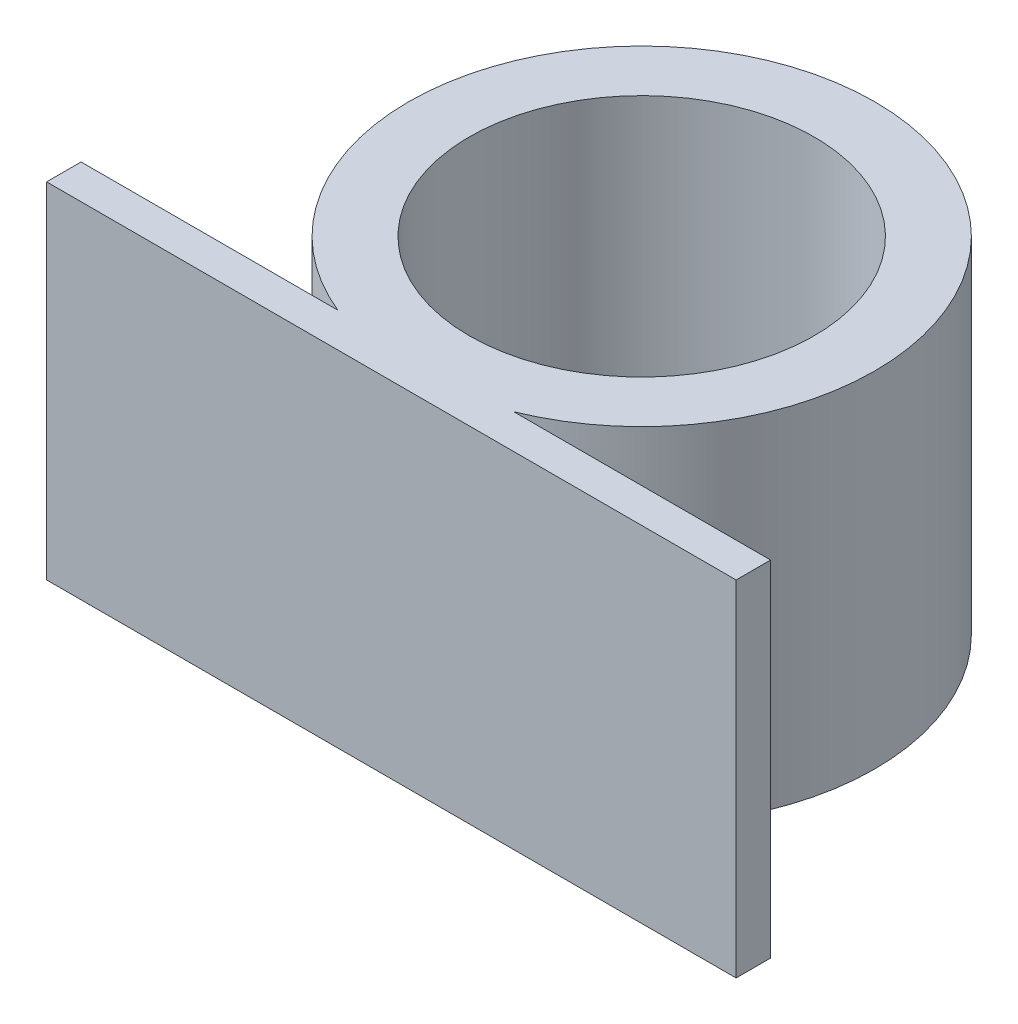
ISO-10303-21;
HEADER;
FILE_DESCRIPTION(('STEP AP214'),'2;1');
FILE_NAME('part.step','',(''),(''),'','','');
FILE_SCHEMA(('AUTOMOTIVE_DESIGN { 1 0 10303 214 1 1 1 1 }'));
ENDSEC;
DATA;
#1=APPLICATION_CONTEXT('core data for automotive mechanical design processes');
#2=APPLICATION_PROTOCOL_DEFINITION('international standard','automotive_design',2000,#1);
#3=PRODUCT_CONTEXT('',#1,'mechanical');
#4=PRODUCT('Part','Part','',(#3));
#5=PRODUCT_RELATED_PRODUCT_CATEGORY('part','',(#4));
#6=PRODUCT_DEFINITION_FORMATION('','',#4);
#7=PRODUCT_DEFINITION_CONTEXT('part definition',#1,'design');
#8=PRODUCT_DEFINITION('design','',#6,#7);
#9=PRODUCT_DEFINITION_SHAPE('','',#8);
#10=(LENGTH_UNIT() NAMED_UNIT(*) SI_UNIT(.MILLI.,.METRE.));
#11=(NAMED_UNIT(*) PLANE_ANGLE_UNIT() SI_UNIT($,.RADIAN.));
#12=(NAMED_UNIT(*) SI_UNIT($,.STERADIAN.) SOLID_ANGLE_UNIT());
#13=UNCERTAINTY_MEASURE_WITH_UNIT(LENGTH_MEASURE(1.E-05),#10,'distance_accuracy_value','');
#14=(GEOMETRIC_REPRESENTATION_CONTEXT(3) GLOBAL_UNCERTAINTY_ASSIGNED_CONTEXT((#13)) GLOBAL_UNIT_ASSIGNED_CONTEXT((#10,
#11,#12)) REPRESENTATION_CONTEXT('',''));
#15=CARTESIAN_POINT('',(0.,0.,0.));
#16=DIRECTION('',(0.,0.,1.));
#17=DIRECTION('',(1.,0.,0.));
#18=AXIS2_PLACEMENT_3D('',#15,#16,#17);
#19=CARTESIAN_POINT('',(0.,20.,0.));
#20=DIRECTION('',(0.,1.,0.));
#21=DIRECTION('',(0.,0.,1.));
#22=AXIS2_PLACEMENT_3D('',#19,#20,#21);
#23=PLANE('',#22);
#24=CARTESIAN_POINT('',(0.,20.,0.));
#25=DIRECTION('',(0.,1.,0.));
#26=DIRECTION('',(0.,0.,1.));
#27=AXIS2_PLACEMENT_3D('',#24,#25,#26);
#28=CIRCLE('',#27,13.5240640700952);
#29=CARTESIAN_POINT('',(5.10373668405712,20.,12.5240640700952));
#30=VERTEX_POINT('',#29);
#31=CARTESIAN_POINT('',(-5.10373668405712,20.,12.5240640700952));
#32=VERTEX_POINT('',#31);
#33=EDGE_CURVE('E146',#30,#32,#28,.T.);
#34=ORIENTED_EDGE('',*,*,#33,.T.);
#35=DIRECTION('',(-1.,0.,0.));
#36=VECTOR('',#35,1.);
#37=CARTESIAN_POINT('',(-20.,20.,12.5240640700952));
#38=LINE('',#37,#36);
#39=CARTESIAN_POINT('',(-20.,20.,12.5240640700952));
#40=VERTEX_POINT('',#39);
#41=EDGE_CURVE('E94',#32,#40,#38,.T.);
#42=ORIENTED_EDGE('',*,*,#41,.T.);
#43=DIRECTION('',(0.,0.,1.));
#44=VECTOR('',#43,1.);
#45=CARTESIAN_POINT('',(-20.,20.,12.5240640700952));
#46=LINE('',#45,#44);
#47=CARTESIAN_POINT('',(-20.,20.,14.5240640700952));
#48=VERTEX_POINT('',#47);
#49=EDGE_CURVE('E107',#40,#48,#46,.T.);
#50=ORIENTED_EDGE('',*,*,#49,.T.);
#51=DIRECTION('',(1.,0.,0.));
#52=VECTOR('',#51,1.);
#53=CARTESIAN_POINT('',(-20.,20.,14.5240640700952));
#54=LINE('',#53,#52);
#55=CARTESIAN_POINT('',(20.,20.,14.5240640700952));
#56=VERTEX_POINT('',#55);
#57=EDGE_CURVE('E101',#48,#56,#54,.T.);
#58=ORIENTED_EDGE('',*,*,#57,.T.);
#59=DIRECTION('',(0.,0.,-1.));
#60=VECTOR('',#59,1.);
#61=CARTESIAN_POINT('',(20.,20.,12.5240640700952));
#62=LINE('',#61,#60);
#63=CARTESIAN_POINT('',(20.,20.,12.5240640700952));
#64=VERTEX_POINT('',#63);
#65=EDGE_CURVE('E105',#56,#64,#62,.T.);
#66=ORIENTED_EDGE('',*,*,#65,.T.);
#67=DIRECTION('',(-1.,0.,0.));
#68=VECTOR('',#67,1.);
#69=CARTESIAN_POINT('',(5.10373668405712,20.,12.5240640700952));
#70=LINE('',#69,#68);
#71=EDGE_CURVE('E57',#64,#30,#70,.T.);
#72=ORIENTED_EDGE('',*,*,#71,.T.);
#73=EDGE_LOOP('',(#34,#42,#50,#58,#66,#72));
#74=FACE_BOUND('',#73,.T.);
#75=CARTESIAN_POINT('',(0.,20.,0.));
#76=DIRECTION('',(0.,1.,0.));
#77=DIRECTION('',(0.,0.,1.));
#78=AXIS2_PLACEMENT_3D('',#75,#76,#77);
#79=CIRCLE('',#78,10.);
#80=CARTESIAN_POINT('',(0.,20.,10.));
#81=VERTEX_POINT('',#80);
#82=EDGE_CURVE('E134',#81,#81,#79,.T.);
#83=ORIENTED_EDGE('',*,*,#82,.F.);
#84=EDGE_LOOP('',(#83));
#85=FACE_BOUND('',#84,.T.);
#86=ADVANCED_FACE('F39',(#74,#85),#23,.T.);
#87=CARTESIAN_POINT('',(0.,0.,0.));
#88=DIRECTION('',(0.,1.,0.));
#89=DIRECTION('',(0.,0.,1.));
#90=AXIS2_PLACEMENT_3D('',#87,#88,#89);
#91=PLANE('',#90);
#92=CARTESIAN_POINT('',(0.,0.,0.));
#93=DIRECTION('',(0.,1.,0.));
#94=DIRECTION('',(0.,0.,1.));
#95=AXIS2_PLACEMENT_3D('',#92,#93,#94);
#96=CIRCLE('',#95,13.5240640700952);
#97=CARTESIAN_POINT('',(5.10373668405712,0.,12.5240640700952));
#98=VERTEX_POINT('',#97);
#99=CARTESIAN_POINT('',(-5.10373668405712,0.,12.5240640700952));
#100=VERTEX_POINT('',#99);
#101=EDGE_CURVE('E129',#98,#100,#96,.T.);
#102=ORIENTED_EDGE('',*,*,#101,.F.);
#103=DIRECTION('',(-1.,0.,0.));
#104=VECTOR('',#103,1.);
#105=CARTESIAN_POINT('',(5.10373668405712,0.,12.5240640700952));
#106=LINE('',#105,#104);
#107=CARTESIAN_POINT('',(20.,0.,12.5240640700952));
#108=VERTEX_POINT('',#107);
#109=EDGE_CURVE('E86',#108,#98,#106,.T.);
#110=ORIENTED_EDGE('',*,*,#109,.F.);
#111=DIRECTION('',(0.,0.,-1.));
#112=VECTOR('',#111,1.);
#113=CARTESIAN_POINT('',(20.,0.,12.5240640700952));
#114=LINE('',#113,#112);
#115=CARTESIAN_POINT('',(20.,0.,14.5240640700952));
#116=VERTEX_POINT('',#115);
#117=EDGE_CURVE('E80',#116,#108,#114,.T.);
#118=ORIENTED_EDGE('',*,*,#117,.F.);
#119=DIRECTION('',(1.,0.,0.));
#120=VECTOR('',#119,1.);
#121=CARTESIAN_POINT('',(-20.,0.,14.5240640700952));
#122=LINE('',#121,#120);
#123=CARTESIAN_POINT('',(-20.,0.,14.5240640700952));
#124=VERTEX_POINT('',#123);
#125=EDGE_CURVE('E116',#124,#116,#122,.T.);
#126=ORIENTED_EDGE('',*,*,#125,.F.);
#127=DIRECTION('',(0.,0.,1.));
#128=VECTOR('',#127,1.);
#129=CARTESIAN_POINT('',(-20.,0.,12.5240640700952));
#130=LINE('',#129,#128);
#131=CARTESIAN_POINT('',(-20.,0.,12.5240640700952));
#132=VERTEX_POINT('',#131);
#133=EDGE_CURVE('E137',#132,#124,#130,.T.);
#134=ORIENTED_EDGE('',*,*,#133,.F.);
#135=DIRECTION('',(-1.,0.,0.));
#136=VECTOR('',#135,1.);
#137=CARTESIAN_POINT('',(-20.,0.,12.5240640700952));
#138=LINE('',#137,#136);
#139=EDGE_CURVE('E133',#100,#132,#138,.T.);
#140=ORIENTED_EDGE('',*,*,#139,.F.);
#141=EDGE_LOOP('',(#102,#110,#118,#126,#134,#140));
#142=FACE_BOUND('',#141,.T.);
#143=CARTESIAN_POINT('',(0.,0.,0.));
#144=DIRECTION('',(0.,1.,0.));
#145=DIRECTION('',(0.,0.,1.));
#146=AXIS2_PLACEMENT_3D('',#143,#144,#145);
#147=CIRCLE('',#146,10.);
#148=CARTESIAN_POINT('',(0.,0.,10.));
#149=VERTEX_POINT('',#148);
#150=EDGE_CURVE('E243',#149,#149,#147,.T.);
#151=ORIENTED_EDGE('',*,*,#150,.T.);
#152=EDGE_LOOP('',(#151));
#153=FACE_BOUND('',#152,.T.);
#154=ADVANCED_FACE('F159',(#142,#153),#91,.F.);
#155=CARTESIAN_POINT('',(0.,20.,0.));
#156=DIRECTION('',(0.,-1.,0.));
#157=DIRECTION('',(0.,0.,-1.));
#158=AXIS2_PLACEMENT_3D('',#155,#156,#157);
#159=CYLINDRICAL_SURFACE('',#158,13.5240640700952);
#160=ORIENTED_EDGE('',*,*,#101,.T.);
#161=DIRECTION('',(0.,-1.,0.));
#162=VECTOR('',#161,1.);
#163=CARTESIAN_POINT('',(-5.10373668405712,20.,12.5240640700952));
#164=LINE('',#163,#162);
#165=EDGE_CURVE('E11',#32,#100,#164,.T.);
#166=ORIENTED_EDGE('',*,*,#165,.F.);
#167=ORIENTED_EDGE('',*,*,#33,.F.);
#168=DIRECTION('',(0.,-1.,0.));
#169=VECTOR('',#168,1.);
#170=CARTESIAN_POINT('',(5.10373668405712,20.,12.5240640700952));
#171=LINE('',#170,#169);
#172=EDGE_CURVE('E125',#30,#98,#171,.T.);
#173=ORIENTED_EDGE('',*,*,#172,.T.);
#174=EDGE_LOOP('',(#160,#166,#167,#173));
#175=FACE_BOUND('',#174,.T.);
#176=ADVANCED_FACE('F41',(#175),#159,.T.);
#177=CARTESIAN_POINT('',(-20.,20.,12.5240640700952));
#178=DIRECTION('',(0.,0.,1.));
#179=DIRECTION('',(1.,0.,0.));
#180=AXIS2_PLACEMENT_3D('',#177,#178,#179);
#181=PLANE('',#180);
#182=ORIENTED_EDGE('',*,*,#139,.T.);
#183=DIRECTION('',(0.,-1.,0.));
#184=VECTOR('',#183,1.);
#185=CARTESIAN_POINT('',(-20.,20.,12.5240640700952));
#186=LINE('',#185,#184);
#187=EDGE_CURVE('E49',#40,#132,#186,.T.);
#188=ORIENTED_EDGE('',*,*,#187,.F.);
#189=ORIENTED_EDGE('',*,*,#41,.F.);
#190=ORIENTED_EDGE('',*,*,#165,.T.);
#191=EDGE_LOOP('',(#182,#188,#189,#190));
#192=FACE_BOUND('',#191,.T.);
#193=ADVANCED_FACE('F184',(#192),#181,.F.);
#194=CARTESIAN_POINT('',(-20.,20.,12.5240640700952));
#195=DIRECTION('',(1.,0.,0.));
#196=DIRECTION('',(0.,0.,-1.));
#197=AXIS2_PLACEMENT_3D('',#194,#195,#196);
#198=PLANE('',#197);
#199=ORIENTED_EDGE('',*,*,#133,.T.);
#200=DIRECTION('',(0.,-1.,0.));
#201=VECTOR('',#200,1.);
#202=CARTESIAN_POINT('',(-20.,20.,14.5240640700952));
#203=LINE('',#202,#201);
#204=EDGE_CURVE('E118',#48,#124,#203,.T.);
#205=ORIENTED_EDGE('',*,*,#204,.F.);
#206=ORIENTED_EDGE('',*,*,#49,.F.);
#207=ORIENTED_EDGE('',*,*,#187,.T.);
#208=EDGE_LOOP('',(#199,#205,#206,#207));
#209=FACE_BOUND('',#208,.T.);
#210=ADVANCED_FACE('F156',(#209),#198,.F.);
#211=CARTESIAN_POINT('',(-20.,20.,14.5240640700952));
#212=DIRECTION('',(0.,0.,-1.));
#213=DIRECTION('',(-1.,0.,0.));
#214=AXIS2_PLACEMENT_3D('',#211,#212,#213);
#215=PLANE('',#214);
#216=ORIENTED_EDGE('',*,*,#125,.T.);
#217=DIRECTION('',(0.,-1.,0.));
#218=VECTOR('',#217,1.);
#219=CARTESIAN_POINT('',(20.,20.,14.5240640700952));
#220=LINE('',#219,#218);
#221=EDGE_CURVE('E113',#56,#116,#220,.T.);
#222=ORIENTED_EDGE('',*,*,#221,.F.);
#223=ORIENTED_EDGE('',*,*,#57,.F.);
#224=ORIENTED_EDGE('',*,*,#204,.T.);
#225=EDGE_LOOP('',(#216,#222,#223,#224));
#226=FACE_BOUND('',#225,.T.);
#227=ADVANCED_FACE('F114',(#226),#215,.F.);
#228=CARTESIAN_POINT('',(20.,20.,12.5240640700952));
#229=DIRECTION('',(-1.,0.,0.));
#230=DIRECTION('',(0.,0.,1.));
#231=AXIS2_PLACEMENT_3D('',#228,#229,#230);
#232=PLANE('',#231);
#233=ORIENTED_EDGE('',*,*,#117,.T.);
#234=DIRECTION('',(0.,-1.,0.));
#235=VECTOR('',#234,1.);
#236=CARTESIAN_POINT('',(20.,20.,12.5240640700952));
#237=LINE('',#236,#235);
#238=EDGE_CURVE('E119',#64,#108,#237,.T.);
#239=ORIENTED_EDGE('',*,*,#238,.F.);
#240=ORIENTED_EDGE('',*,*,#65,.F.);
#241=ORIENTED_EDGE('',*,*,#221,.T.);
#242=EDGE_LOOP('',(#233,#239,#240,#241));
#243=FACE_BOUND('',#242,.T.);
#244=ADVANCED_FACE('F121',(#243),#232,.F.);
#245=CARTESIAN_POINT('',(5.10373668405712,20.,12.5240640700952));
#246=DIRECTION('',(0.,0.,1.));
#247=DIRECTION('',(1.,0.,0.));
#248=AXIS2_PLACEMENT_3D('',#245,#246,#247);
#249=PLANE('',#248);
#250=ORIENTED_EDGE('',*,*,#109,.T.);
#251=ORIENTED_EDGE('',*,*,#172,.F.);
#252=ORIENTED_EDGE('',*,*,#71,.F.);
#253=ORIENTED_EDGE('',*,*,#238,.T.);
#254=EDGE_LOOP('',(#250,#251,#252,#253));
#255=FACE_BOUND('',#254,.T.);
#256=ADVANCED_FACE('F164',(#255),#249,.F.);
#257=CARTESIAN_POINT('',(0.,20.,0.));
#258=DIRECTION('',(0.,-1.,0.));
#259=DIRECTION('',(0.,0.,-1.));
#260=AXIS2_PLACEMENT_3D('',#257,#258,#259);
#261=CYLINDRICAL_SURFACE('',#260,10.);
#262=ORIENTED_EDGE('',*,*,#82,.T.);
#263=EDGE_LOOP('',(#262));
#264=FACE_BOUND('',#263,.T.);
#265=ORIENTED_EDGE('',*,*,#150,.F.);
#266=EDGE_LOOP('',(#265));
#267=FACE_BOUND('',#266,.T.);
#268=ADVANCED_FACE('F166',(#264,#267),#261,.F.);
#269=CLOSED_SHELL('',(#86,#154,#176,#193,#210,#227,#244,#256,#268));
#270=MANIFOLD_SOLID_BREP('B2',#269);
#271=ADVANCED_BREP_SHAPE_REPRESENTATION('',(#18,#270),#14);
#272=SHAPE_DEFINITION_REPRESENTATION(#9,#271);
ENDSEC;
END-ISO-10303-21;
